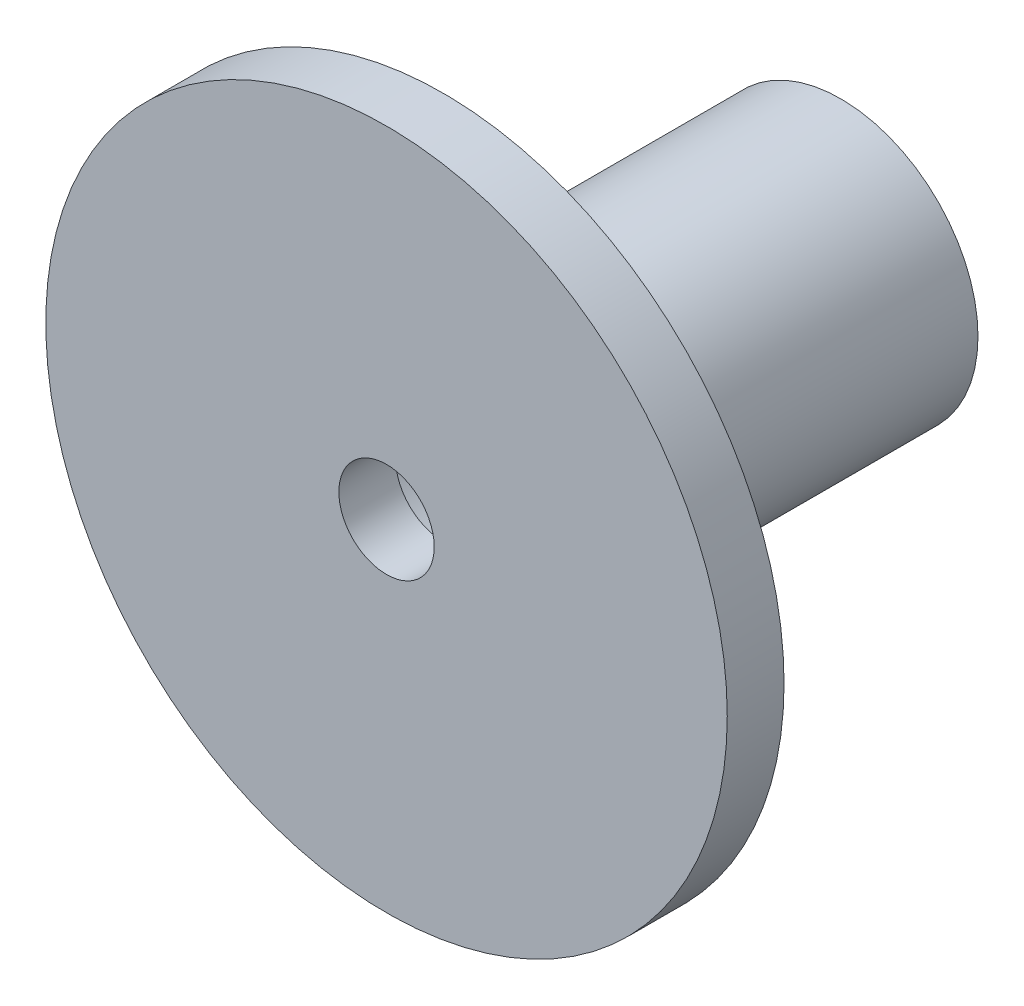
ISO-10303-21;
HEADER;
FILE_DESCRIPTION(('STEP AP214'),'2;1');
FILE_NAME('part.step','',(''),(''),'','','');
FILE_SCHEMA(('AUTOMOTIVE_DESIGN { 1 0 10303 214 1 1 1 1 }'));
ENDSEC;
DATA;
#1=APPLICATION_CONTEXT('core data for automotive mechanical design processes');
#2=APPLICATION_PROTOCOL_DEFINITION('international standard','automotive_design',2000,#1);
#3=PRODUCT_CONTEXT('',#1,'mechanical');
#4=PRODUCT('Part','Part','',(#3));
#5=PRODUCT_RELATED_PRODUCT_CATEGORY('part','',(#4));
#6=PRODUCT_DEFINITION_FORMATION('','',#4);
#7=PRODUCT_DEFINITION_CONTEXT('part definition',#1,'design');
#8=PRODUCT_DEFINITION('design','',#6,#7);
#9=PRODUCT_DEFINITION_SHAPE('','',#8);
#10=(LENGTH_UNIT() NAMED_UNIT(*) SI_UNIT(.MILLI.,.METRE.));
#11=(NAMED_UNIT(*) PLANE_ANGLE_UNIT() SI_UNIT($,.RADIAN.));
#12=(NAMED_UNIT(*) SI_UNIT($,.STERADIAN.) SOLID_ANGLE_UNIT());
#13=UNCERTAINTY_MEASURE_WITH_UNIT(LENGTH_MEASURE(1.E-05),#10,'distance_accuracy_value','');
#14=(GEOMETRIC_REPRESENTATION_CONTEXT(3) GLOBAL_UNCERTAINTY_ASSIGNED_CONTEXT((#13)) GLOBAL_UNIT_ASSIGNED_CONTEXT((#10,
#11,#12)) REPRESENTATION_CONTEXT('',''));
#15=CARTESIAN_POINT('',(0.,0.,0.));
#16=DIRECTION('',(0.,0.,1.));
#17=DIRECTION('',(1.,0.,0.));
#18=AXIS2_PLACEMENT_3D('',#15,#16,#17);
#19=CARTESIAN_POINT('',(0.,0.,70.));
#20=DIRECTION('',(0.,0.,-1.));
#21=DIRECTION('',(-1.,0.,0.));
#22=AXIS2_PLACEMENT_3D('',#19,#20,#21);
#23=CYLINDRICAL_SURFACE('',#22,20.3);
#24=CARTESIAN_POINT('',(0.,0.,0.));
#25=DIRECTION('',(0.,0.,1.));
#26=DIRECTION('',(1.,0.,0.));
#27=AXIS2_PLACEMENT_3D('',#24,#25,#26);
#28=CIRCLE('',#27,20.3);
#29=CARTESIAN_POINT('',(20.3,0.,0.));
#30=VERTEX_POINT('',#29);
#31=EDGE_CURVE('E50',#30,#30,#28,.T.);
#32=ORIENTED_EDGE('',*,*,#31,.F.);
#33=EDGE_LOOP('',(#32));
#34=FACE_BOUND('',#33,.T.);
#35=CARTESIAN_POINT('',(0.,0.,66.8));
#36=DIRECTION('',(0.,0.,1.));
#37=DIRECTION('',(1.,0.,0.));
#38=AXIS2_PLACEMENT_3D('',#35,#36,#37);
#39=CIRCLE('',#38,20.3);
#40=CARTESIAN_POINT('',(20.3,0.,66.8));
#41=VERTEX_POINT('',#40);
#42=EDGE_CURVE('E59',#41,#41,#39,.F.);
#43=ORIENTED_EDGE('',*,*,#42,.F.);
#44=EDGE_LOOP('',(#43));
#45=FACE_BOUND('',#44,.T.);
#46=ADVANCED_FACE('F39',(#34,#45),#23,.F.);
#47=CARTESIAN_POINT('',(0.,0.,70.));
#48=DIRECTION('',(0.,0.,-1.));
#49=DIRECTION('',(-1.,0.,0.));
#50=AXIS2_PLACEMENT_3D('',#47,#48,#49);
#51=CYLINDRICAL_SURFACE('',#50,24.15);
#52=CARTESIAN_POINT('',(0.,0.,70.));
#53=DIRECTION('',(0.,0.,1.));
#54=DIRECTION('',(1.,0.,0.));
#55=AXIS2_PLACEMENT_3D('',#52,#53,#54);
#56=CIRCLE('',#55,24.15);
#57=CARTESIAN_POINT('',(24.15,0.,70.));
#58=VERTEX_POINT('',#57);
#59=EDGE_CURVE('E10',#58,#58,#56,.T.);
#60=ORIENTED_EDGE('',*,*,#59,.F.);
#61=EDGE_LOOP('',(#60));
#62=FACE_BOUND('',#61,.T.);
#63=CARTESIAN_POINT('',(0.,0.,0.));
#64=DIRECTION('',(0.,0.,1.));
#65=DIRECTION('',(1.,0.,0.));
#66=AXIS2_PLACEMENT_3D('',#63,#64,#65);
#67=CIRCLE('',#66,24.15);
#68=CARTESIAN_POINT('',(24.15,0.,0.));
#69=VERTEX_POINT('',#68);
#70=EDGE_CURVE('E42',#69,#69,#67,.T.);
#71=ORIENTED_EDGE('',*,*,#70,.T.);
#72=EDGE_LOOP('',(#71));
#73=FACE_BOUND('',#72,.T.);
#74=ADVANCED_FACE('F97',(#62,#73),#51,.T.);
#75=CARTESIAN_POINT('',(0.,0.,0.));
#76=DIRECTION('',(0.,0.,1.));
#77=DIRECTION('',(1.,0.,0.));
#78=AXIS2_PLACEMENT_3D('',#75,#76,#77);
#79=PLANE('',#78);
#80=ORIENTED_EDGE('',*,*,#31,.T.);
#81=EDGE_LOOP('',(#80));
#82=FACE_BOUND('',#81,.T.);
#83=ORIENTED_EDGE('',*,*,#70,.F.);
#84=EDGE_LOOP('',(#83));
#85=FACE_BOUND('',#84,.T.);
#86=ADVANCED_FACE('F104',(#82,#85),#79,.F.);
#87=CARTESIAN_POINT('',(0.,0.,66.8));
#88=DIRECTION('',(0.,0.,1.));
#89=DIRECTION('',(1.,0.,0.));
#90=AXIS2_PLACEMENT_3D('',#87,#88,#89);
#91=CYLINDRICAL_SURFACE('',#90,21.65);
#92=CARTESIAN_POINT('',(0.,0.,66.8));
#93=DIRECTION('',(0.,0.,1.));
#94=DIRECTION('',(1.,0.,0.));
#95=AXIS2_PLACEMENT_3D('',#92,#93,#94);
#96=CIRCLE('',#95,21.65);
#97=CARTESIAN_POINT('',(21.65,0.,66.8));
#98=VERTEX_POINT('',#97);
#99=EDGE_CURVE('E55',#98,#98,#96,.T.);
#100=ORIENTED_EDGE('',*,*,#99,.F.);
#101=EDGE_LOOP('',(#100));
#102=FACE_BOUND('',#101,.T.);
#103=CARTESIAN_POINT('',(0.,0.,70.));
#104=DIRECTION('',(0.,0.,1.));
#105=DIRECTION('',(1.,0.,0.));
#106=AXIS2_PLACEMENT_3D('',#103,#104,#105);
#107=CIRCLE('',#106,21.65);
#108=CARTESIAN_POINT('',(21.65,0.,70.));
#109=VERTEX_POINT('',#108);
#110=EDGE_CURVE('E52',#109,#109,#107,.T.);
#111=ORIENTED_EDGE('',*,*,#110,.T.);
#112=EDGE_LOOP('',(#111));
#113=FACE_BOUND('',#112,.T.);
#114=ADVANCED_FACE('F110',(#102,#113),#91,.F.);
#115=CARTESIAN_POINT('',(0.,0.,66.8));
#116=DIRECTION('',(0.,0.,1.));
#117=DIRECTION('',(1.,0.,0.));
#118=AXIS2_PLACEMENT_3D('',#115,#116,#117);
#119=PLANE('',#118);
#120=ORIENTED_EDGE('',*,*,#42,.T.);
#121=EDGE_LOOP('',(#120));
#122=FACE_BOUND('',#121,.T.);
#123=ORIENTED_EDGE('',*,*,#99,.T.);
#124=EDGE_LOOP('',(#123));
#125=FACE_BOUND('',#124,.T.);
#126=ADVANCED_FACE('F93',(#122,#125),#119,.T.);
#127=CARTESIAN_POINT('',(0.,0.,70.));
#128=DIRECTION('',(0.,0.,1.));
#129=DIRECTION('',(1.,0.,0.));
#130=AXIS2_PLACEMENT_3D('',#127,#128,#129);
#131=PLANE('',#130);
#132=CARTESIAN_POINT('',(0.,0.,70.));
#133=DIRECTION('',(0.,0.,1.));
#134=DIRECTION('',(1.,0.,0.));
#135=AXIS2_PLACEMENT_3D('',#132,#133,#134);
#136=CIRCLE('',#135,8.4);
#137=CARTESIAN_POINT('',(8.4,0.,70.));
#138=VERTEX_POINT('',#137);
#139=EDGE_CURVE('E72',#138,#138,#136,.T.);
#140=ORIENTED_EDGE('',*,*,#139,.T.);
#141=EDGE_LOOP('',(#140));
#142=FACE_BOUND('',#141,.T.);
#143=ORIENTED_EDGE('',*,*,#110,.F.);
#144=EDGE_LOOP('',(#143));
#145=FACE_BOUND('',#144,.T.);
#146=ADVANCED_FACE('F84',(#142,#145),#131,.F.);
#147=CARTESIAN_POINT('',(0.,0.,80.));
#148=DIRECTION('',(0.,0.,1.));
#149=DIRECTION('',(1.,0.,0.));
#150=AXIS2_PLACEMENT_3D('',#147,#148,#149);
#151=PLANE('',#150);
#152=CARTESIAN_POINT('',(0.,0.,80.));
#153=DIRECTION('',(0.,0.,1.));
#154=DIRECTION('',(1.,0.,0.));
#155=AXIS2_PLACEMENT_3D('',#152,#153,#154);
#156=CIRCLE('',#155,60.);
#157=CARTESIAN_POINT('',(60.,0.,80.));
#158=VERTEX_POINT('',#157);
#159=EDGE_CURVE('E68',#158,#158,#156,.T.);
#160=ORIENTED_EDGE('',*,*,#159,.T.);
#161=EDGE_LOOP('',(#160));
#162=FACE_BOUND('',#161,.T.);
#163=CARTESIAN_POINT('',(0.,0.,80.));
#164=DIRECTION('',(0.,0.,1.));
#165=DIRECTION('',(1.,0.,0.));
#166=AXIS2_PLACEMENT_3D('',#163,#164,#165);
#167=CIRCLE('',#166,8.4);
#168=CARTESIAN_POINT('',(8.4,0.,80.));
#169=VERTEX_POINT('',#168);
#170=EDGE_CURVE('E69',#169,#169,#167,.T.);
#171=ORIENTED_EDGE('',*,*,#170,.F.);
#172=EDGE_LOOP('',(#171));
#173=FACE_BOUND('',#172,.T.);
#174=ADVANCED_FACE('F81',(#162,#173),#151,.T.);
#175=ORIENTED_EDGE('',*,*,#59,.T.);
#176=EDGE_LOOP('',(#175));
#177=FACE_BOUND('',#176,.T.);
#178=CARTESIAN_POINT('',(0.,0.,70.));
#179=DIRECTION('',(0.,0.,1.));
#180=DIRECTION('',(1.,0.,0.));
#181=AXIS2_PLACEMENT_3D('',#178,#179,#180);
#182=CIRCLE('',#181,60.);
#183=CARTESIAN_POINT('',(60.,0.,70.));
#184=VERTEX_POINT('',#183);
#185=EDGE_CURVE('E65',#184,#184,#182,.T.);
#186=ORIENTED_EDGE('',*,*,#185,.F.);
#187=EDGE_LOOP('',(#186));
#188=FACE_BOUND('',#187,.T.);
#189=ADVANCED_FACE('F83',(#177,#188),#131,.F.);
#190=CARTESIAN_POINT('',(0.,0.,80.));
#191=DIRECTION('',(0.,0.,-1.));
#192=DIRECTION('',(-1.,0.,0.));
#193=AXIS2_PLACEMENT_3D('',#190,#191,#192);
#194=CYLINDRICAL_SURFACE('',#193,60.);
#195=ORIENTED_EDGE('',*,*,#159,.F.);
#196=EDGE_LOOP('',(#195));
#197=FACE_BOUND('',#196,.T.);
#198=ORIENTED_EDGE('',*,*,#185,.T.);
#199=EDGE_LOOP('',(#198));
#200=FACE_BOUND('',#199,.T.);
#201=ADVANCED_FACE('F91',(#197,#200),#194,.T.);
#202=CARTESIAN_POINT('',(0.,0.,80.));
#203=DIRECTION('',(0.,0.,-1.));
#204=DIRECTION('',(-1.,0.,0.));
#205=AXIS2_PLACEMENT_3D('',#202,#203,#204);
#206=CYLINDRICAL_SURFACE('',#205,8.4);
#207=ORIENTED_EDGE('',*,*,#170,.T.);
#208=EDGE_LOOP('',(#207));
#209=FACE_BOUND('',#208,.T.);
#210=ORIENTED_EDGE('',*,*,#139,.F.);
#211=EDGE_LOOP('',(#210));
#212=FACE_BOUND('',#211,.T.);
#213=ADVANCED_FACE('F78',(#209,#212),#206,.F.);
#214=CLOSED_SHELL('',(#46,#74,#86,#114,#126,#146,#174,#189,#201,#213));
#215=MANIFOLD_SOLID_BREP('B2',#214);
#216=ADVANCED_BREP_SHAPE_REPRESENTATION('',(#18,#215),#14);
#217=SHAPE_DEFINITION_REPRESENTATION(#9,#216);
ENDSEC;
END-ISO-10303-21;
